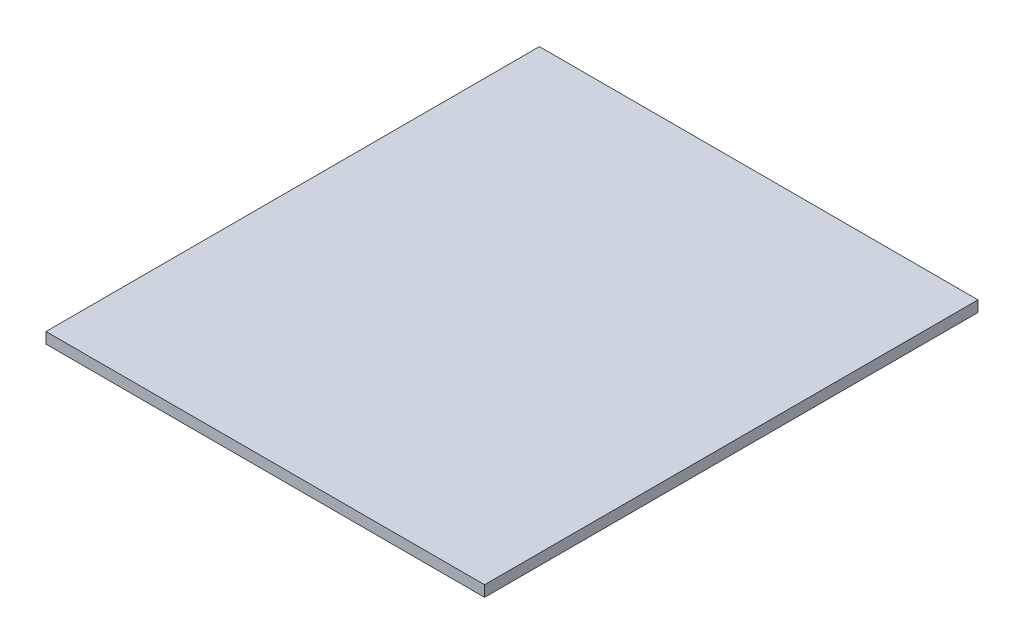
ISO-10303-21;
HEADER;
FILE_DESCRIPTION(('STEP AP214'),'2;1');
FILE_NAME('part.step','',(''),(''),'','','');
FILE_SCHEMA(('AUTOMOTIVE_DESIGN { 1 0 10303 214 1 1 1 1 }'));
ENDSEC;
DATA;
#1=APPLICATION_CONTEXT('core data for automotive mechanical design processes');
#2=APPLICATION_PROTOCOL_DEFINITION('international standard','automotive_design',2000,#1);
#3=PRODUCT_CONTEXT('',#1,'mechanical');
#4=PRODUCT('Part','Part','',(#3));
#5=PRODUCT_RELATED_PRODUCT_CATEGORY('part','',(#4));
#6=PRODUCT_DEFINITION_FORMATION('','',#4);
#7=PRODUCT_DEFINITION_CONTEXT('part definition',#1,'design');
#8=PRODUCT_DEFINITION('design','',#6,#7);
#9=PRODUCT_DEFINITION_SHAPE('','',#8);
#10=(LENGTH_UNIT() NAMED_UNIT(*) SI_UNIT(.MILLI.,.METRE.));
#11=(NAMED_UNIT(*) PLANE_ANGLE_UNIT() SI_UNIT($,.RADIAN.));
#12=(NAMED_UNIT(*) SI_UNIT($,.STERADIAN.) SOLID_ANGLE_UNIT());
#13=UNCERTAINTY_MEASURE_WITH_UNIT(LENGTH_MEASURE(1.E-05),#10,'distance_accuracy_value','');
#14=(GEOMETRIC_REPRESENTATION_CONTEXT(3) GLOBAL_UNCERTAINTY_ASSIGNED_CONTEXT((#13)) GLOBAL_UNIT_ASSIGNED_CONTEXT((#10,
#11,#12)) REPRESENTATION_CONTEXT('',''));
#15=CARTESIAN_POINT('',(0.,0.,0.));
#16=DIRECTION('',(0.,0.,1.));
#17=DIRECTION('',(1.,0.,0.));
#18=AXIS2_PLACEMENT_3D('',#15,#16,#17);
#19=CARTESIAN_POINT('',(200.,10.,225.));
#20=DIRECTION('',(-1.,0.,0.));
#21=DIRECTION('',(0.,0.,1.));
#22=AXIS2_PLACEMENT_3D('',#19,#20,#21);
#23=PLANE('',#22);
#24=DIRECTION('',(0.,0.,-1.));
#25=VECTOR('',#24,1.);
#26=CARTESIAN_POINT('',(200.,0.,225.));
#27=LINE('',#26,#25);
#28=CARTESIAN_POINT('',(200.,0.,225.));
#29=VERTEX_POINT('',#28);
#30=CARTESIAN_POINT('',(200.,0.,-225.));
#31=VERTEX_POINT('',#30);
#32=EDGE_CURVE('E98',#29,#31,#27,.T.);
#33=ORIENTED_EDGE('',*,*,#32,.T.);
#34=DIRECTION('',(0.,-1.,0.));
#35=VECTOR('',#34,1.);
#36=CARTESIAN_POINT('',(200.,10.,-225.));
#37=LINE('',#36,#35);
#38=CARTESIAN_POINT('',(200.,10.,-225.));
#39=VERTEX_POINT('',#38);
#40=EDGE_CURVE('E11',#39,#31,#37,.T.);
#41=ORIENTED_EDGE('',*,*,#40,.F.);
#42=DIRECTION('',(0.,0.,-1.));
#43=VECTOR('',#42,1.);
#44=CARTESIAN_POINT('',(200.,10.,225.));
#45=LINE('',#44,#43);
#46=CARTESIAN_POINT('',(200.,10.,225.));
#47=VERTEX_POINT('',#46);
#48=EDGE_CURVE('E86',#47,#39,#45,.T.);
#49=ORIENTED_EDGE('',*,*,#48,.F.);
#50=DIRECTION('',(0.,-1.,0.));
#51=VECTOR('',#50,1.);
#52=CARTESIAN_POINT('',(200.,10.,225.));
#53=LINE('',#52,#51);
#54=EDGE_CURVE('E94',#47,#29,#53,.T.);
#55=ORIENTED_EDGE('',*,*,#54,.T.);
#56=EDGE_LOOP('',(#33,#41,#49,#55));
#57=FACE_BOUND('',#56,.T.);
#58=ADVANCED_FACE('F35',(#57),#23,.F.);
#59=CARTESIAN_POINT('',(-200.,10.,-225.));
#60=DIRECTION('',(0.,0.,1.));
#61=DIRECTION('',(1.,0.,0.));
#62=AXIS2_PLACEMENT_3D('',#59,#60,#61);
#63=PLANE('',#62);
#64=DIRECTION('',(-1.,0.,0.));
#65=VECTOR('',#64,1.);
#66=CARTESIAN_POINT('',(-200.,0.,-225.));
#67=LINE('',#66,#65);
#68=CARTESIAN_POINT('',(-200.,0.,-225.));
#69=VERTEX_POINT('',#68);
#70=EDGE_CURVE('E90',#31,#69,#67,.T.);
#71=ORIENTED_EDGE('',*,*,#70,.T.);
#72=DIRECTION('',(0.,-1.,0.));
#73=VECTOR('',#72,1.);
#74=CARTESIAN_POINT('',(-200.,10.,-225.));
#75=LINE('',#74,#73);
#76=CARTESIAN_POINT('',(-200.,10.,-225.));
#77=VERTEX_POINT('',#76);
#78=EDGE_CURVE('E43',#77,#69,#75,.T.);
#79=ORIENTED_EDGE('',*,*,#78,.F.);
#80=DIRECTION('',(-1.,0.,0.));
#81=VECTOR('',#80,1.);
#82=CARTESIAN_POINT('',(-200.,10.,-225.));
#83=LINE('',#82,#81);
#84=EDGE_CURVE('E81',#39,#77,#83,.T.);
#85=ORIENTED_EDGE('',*,*,#84,.F.);
#86=ORIENTED_EDGE('',*,*,#40,.T.);
#87=EDGE_LOOP('',(#71,#79,#85,#86));
#88=FACE_BOUND('',#87,.T.);
#89=ADVANCED_FACE('F89',(#88),#63,.F.);
#90=CARTESIAN_POINT('',(-200.,10.,225.));
#91=DIRECTION('',(1.,0.,0.));
#92=DIRECTION('',(0.,0.,-1.));
#93=AXIS2_PLACEMENT_3D('',#90,#91,#92);
#94=PLANE('',#93);
#95=DIRECTION('',(0.,0.,1.));
#96=VECTOR('',#95,1.);
#97=CARTESIAN_POINT('',(-200.,0.,225.));
#98=LINE('',#97,#96);
#99=CARTESIAN_POINT('',(-200.,0.,225.));
#100=VERTEX_POINT('',#99);
#101=EDGE_CURVE('E68',#69,#100,#98,.T.);
#102=ORIENTED_EDGE('',*,*,#101,.T.);
#103=DIRECTION('',(0.,-1.,0.));
#104=VECTOR('',#103,1.);
#105=CARTESIAN_POINT('',(-200.,10.,225.));
#106=LINE('',#105,#104);
#107=CARTESIAN_POINT('',(-200.,10.,225.));
#108=VERTEX_POINT('',#107);
#109=EDGE_CURVE('E91',#108,#100,#106,.T.);
#110=ORIENTED_EDGE('',*,*,#109,.F.);
#111=DIRECTION('',(0.,0.,1.));
#112=VECTOR('',#111,1.);
#113=CARTESIAN_POINT('',(-200.,10.,225.));
#114=LINE('',#113,#112);
#115=EDGE_CURVE('E84',#77,#108,#114,.T.);
#116=ORIENTED_EDGE('',*,*,#115,.F.);
#117=ORIENTED_EDGE('',*,*,#78,.T.);
#118=EDGE_LOOP('',(#102,#110,#116,#117));
#119=FACE_BOUND('',#118,.T.);
#120=ADVANCED_FACE('F92',(#119),#94,.F.);
#121=CARTESIAN_POINT('',(-200.,10.,225.));
#122=DIRECTION('',(0.,0.,-1.));
#123=DIRECTION('',(-1.,0.,0.));
#124=AXIS2_PLACEMENT_3D('',#121,#122,#123);
#125=PLANE('',#124);
#126=DIRECTION('',(1.,0.,0.));
#127=VECTOR('',#126,1.);
#128=CARTESIAN_POINT('',(-200.,0.,225.));
#129=LINE('',#128,#127);
#130=EDGE_CURVE('E74',#100,#29,#129,.T.);
#131=ORIENTED_EDGE('',*,*,#130,.T.);
#132=ORIENTED_EDGE('',*,*,#54,.F.);
#133=DIRECTION('',(1.,0.,0.));
#134=VECTOR('',#133,1.);
#135=CARTESIAN_POINT('',(-200.,10.,225.));
#136=LINE('',#135,#134);
#137=EDGE_CURVE('E51',#108,#47,#136,.T.);
#138=ORIENTED_EDGE('',*,*,#137,.F.);
#139=ORIENTED_EDGE('',*,*,#109,.T.);
#140=EDGE_LOOP('',(#131,#132,#138,#139));
#141=FACE_BOUND('',#140,.T.);
#142=ADVANCED_FACE('F105',(#141),#125,.F.);
#143=CARTESIAN_POINT('',(0.,10.,0.));
#144=DIRECTION('',(0.,-1.,0.));
#145=DIRECTION('',(0.,0.,-1.));
#146=AXIS2_PLACEMENT_3D('',#143,#144,#145);
#147=PLANE('',#146);
#148=ORIENTED_EDGE('',*,*,#48,.T.);
#149=ORIENTED_EDGE('',*,*,#84,.T.);
#150=ORIENTED_EDGE('',*,*,#115,.T.);
#151=ORIENTED_EDGE('',*,*,#137,.T.);
#152=EDGE_LOOP('',(#148,#149,#150,#151));
#153=FACE_BOUND('',#152,.T.);
#154=ADVANCED_FACE('F82',(#153),#147,.F.);
#155=CARTESIAN_POINT('',(0.,0.,0.));
#156=DIRECTION('',(0.,-1.,0.));
#157=DIRECTION('',(0.,0.,-1.));
#158=AXIS2_PLACEMENT_3D('',#155,#156,#157);
#159=PLANE('',#158);
#160=ORIENTED_EDGE('',*,*,#32,.F.);
#161=ORIENTED_EDGE('',*,*,#130,.F.);
#162=ORIENTED_EDGE('',*,*,#101,.F.);
#163=ORIENTED_EDGE('',*,*,#70,.F.);
#164=EDGE_LOOP('',(#160,#161,#162,#163));
#165=FACE_BOUND('',#164,.T.);
#166=ADVANCED_FACE('F108',(#165),#159,.T.);
#167=CLOSED_SHELL('',(#58,#89,#120,#142,#154,#166));
#168=MANIFOLD_SOLID_BREP('B2',#167);
#169=ADVANCED_BREP_SHAPE_REPRESENTATION('',(#18,#168),#14);
#170=SHAPE_DEFINITION_REPRESENTATION(#9,#169);
ENDSEC;
END-ISO-10303-21;
